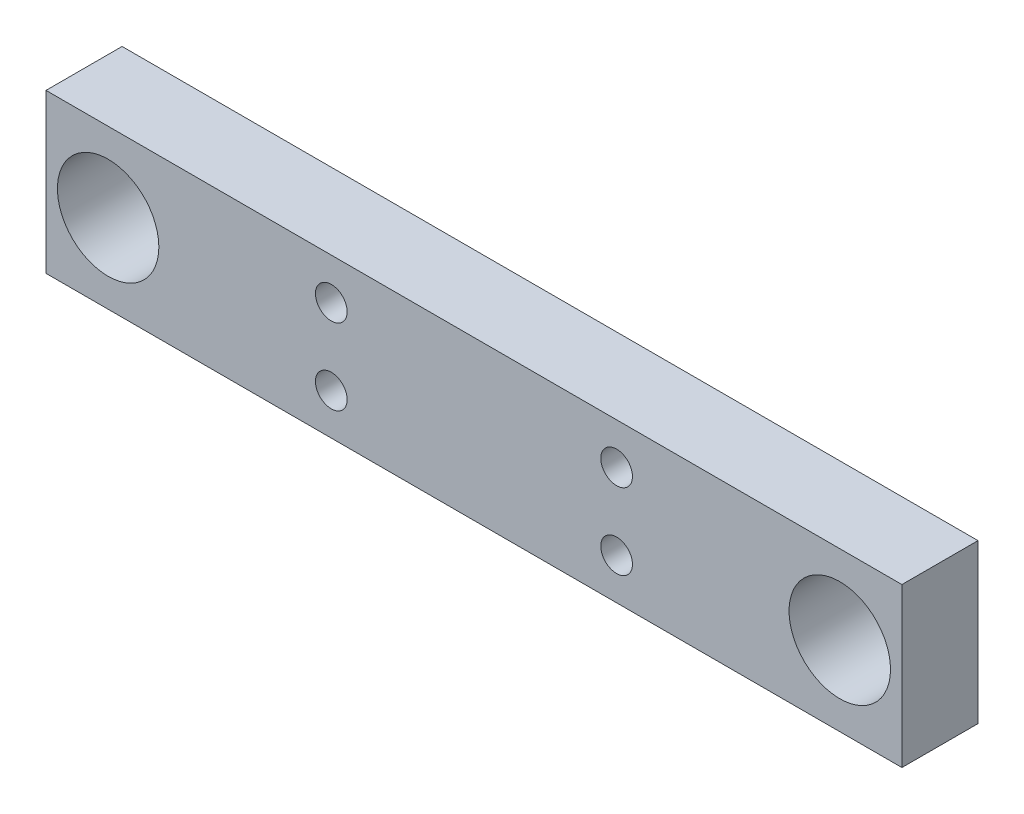
ISO-10303-21;
HEADER;
FILE_DESCRIPTION(('STEP AP214'),'2;1');
FILE_NAME('part.step','',(''),(''),'','','');
FILE_SCHEMA(('AUTOMOTIVE_DESIGN { 1 0 10303 214 1 1 1 1 }'));
ENDSEC;
DATA;
#1=APPLICATION_CONTEXT('core data for automotive mechanical design processes');
#2=APPLICATION_PROTOCOL_DEFINITION('international standard','automotive_design',2000,#1);
#3=PRODUCT_CONTEXT('',#1,'mechanical');
#4=PRODUCT('Part','Part','',(#3));
#5=PRODUCT_RELATED_PRODUCT_CATEGORY('part','',(#4));
#6=PRODUCT_DEFINITION_FORMATION('','',#4);
#7=PRODUCT_DEFINITION_CONTEXT('part definition',#1,'design');
#8=PRODUCT_DEFINITION('design','',#6,#7);
#9=PRODUCT_DEFINITION_SHAPE('','',#8);
#10=(LENGTH_UNIT() NAMED_UNIT(*) SI_UNIT(.MILLI.,.METRE.));
#11=(NAMED_UNIT(*) PLANE_ANGLE_UNIT() SI_UNIT($,.RADIAN.));
#12=(NAMED_UNIT(*) SI_UNIT($,.STERADIAN.) SOLID_ANGLE_UNIT());
#13=UNCERTAINTY_MEASURE_WITH_UNIT(LENGTH_MEASURE(1.E-05),#10,'distance_accuracy_value','');
#14=(GEOMETRIC_REPRESENTATION_CONTEXT(3) GLOBAL_UNCERTAINTY_ASSIGNED_CONTEXT((#13)) GLOBAL_UNIT_ASSIGNED_CONTEXT((#10,
#11,#12)) REPRESENTATION_CONTEXT('',''));
#15=CARTESIAN_POINT('',(0.,0.,0.));
#16=DIRECTION('',(0.,0.,1.));
#17=DIRECTION('',(1.,0.,0.));
#18=AXIS2_PLACEMENT_3D('',#15,#16,#17);
#19=CARTESIAN_POINT('',(-67.5,-12.5,6.));
#20=DIRECTION('',(0.,1.,0.));
#21=DIRECTION('',(-1.,0.,0.));
#22=AXIS2_PLACEMENT_3D('',#19,#20,#21);
#23=PLANE('',#22);
#24=DIRECTION('',(1.,0.,0.));
#25=VECTOR('',#24,1.);
#26=CARTESIAN_POINT('',(-67.5,-12.5,-6.));
#27=LINE('',#26,#25);
#28=CARTESIAN_POINT('',(-67.5,-12.5,-6.));
#29=VERTEX_POINT('',#28);
#30=CARTESIAN_POINT('',(67.5,-12.5,-6.));
#31=VERTEX_POINT('',#30);
#32=EDGE_CURVE('E107',#29,#31,#27,.T.);
#33=ORIENTED_EDGE('',*,*,#32,.T.);
#34=DIRECTION('',(0.,0.,-1.));
#35=VECTOR('',#34,1.);
#36=CARTESIAN_POINT('',(67.5,-12.5,6.));
#37=LINE('',#36,#35);
#38=CARTESIAN_POINT('',(67.5,-12.5,6.));
#39=VERTEX_POINT('',#38);
#40=EDGE_CURVE('E11',#39,#31,#37,.T.);
#41=ORIENTED_EDGE('',*,*,#40,.F.);
#42=DIRECTION('',(1.,0.,0.));
#43=VECTOR('',#42,1.);
#44=CARTESIAN_POINT('',(-67.5,-12.5,6.));
#45=LINE('',#44,#43);
#46=CARTESIAN_POINT('',(-67.5,-12.5,6.));
#47=VERTEX_POINT('',#46);
#48=EDGE_CURVE('E89',#47,#39,#45,.T.);
#49=ORIENTED_EDGE('',*,*,#48,.F.);
#50=DIRECTION('',(0.,0.,-1.));
#51=VECTOR('',#50,1.);
#52=CARTESIAN_POINT('',(-67.5,-12.5,6.));
#53=LINE('',#52,#51);
#54=EDGE_CURVE('E56',#47,#29,#53,.T.);
#55=ORIENTED_EDGE('',*,*,#54,.T.);
#56=EDGE_LOOP('',(#33,#41,#49,#55));
#57=FACE_BOUND('',#56,.T.);
#58=ADVANCED_FACE('F39',(#57),#23,.F.);
#59=CARTESIAN_POINT('',(67.5,-12.5,6.));
#60=DIRECTION('',(-1.,0.,0.));
#61=DIRECTION('',(0.,0.,1.));
#62=AXIS2_PLACEMENT_3D('',#59,#60,#61);
#63=PLANE('',#62);
#64=DIRECTION('',(0.,1.,0.));
#65=VECTOR('',#64,1.);
#66=CARTESIAN_POINT('',(67.5,-12.5,-6.));
#67=LINE('',#66,#65);
#68=CARTESIAN_POINT('',(67.5,12.5,-6.));
#69=VERTEX_POINT('',#68);
#70=EDGE_CURVE('E95',#31,#69,#67,.T.);
#71=ORIENTED_EDGE('',*,*,#70,.T.);
#72=DIRECTION('',(0.,0.,-1.));
#73=VECTOR('',#72,1.);
#74=CARTESIAN_POINT('',(67.5,12.5,6.));
#75=LINE('',#74,#73);
#76=CARTESIAN_POINT('',(67.5,12.5,6.));
#77=VERTEX_POINT('',#76);
#78=EDGE_CURVE('E48',#77,#69,#75,.T.);
#79=ORIENTED_EDGE('',*,*,#78,.F.);
#80=DIRECTION('',(0.,1.,0.));
#81=VECTOR('',#80,1.);
#82=CARTESIAN_POINT('',(67.5,-12.5,6.));
#83=LINE('',#82,#81);
#84=EDGE_CURVE('E81',#39,#77,#83,.T.);
#85=ORIENTED_EDGE('',*,*,#84,.F.);
#86=ORIENTED_EDGE('',*,*,#40,.T.);
#87=EDGE_LOOP('',(#71,#79,#85,#86));
#88=FACE_BOUND('',#87,.T.);
#89=ADVANCED_FACE('F94',(#88),#63,.F.);
#90=CARTESIAN_POINT('',(-67.5,12.5,6.));
#91=DIRECTION('',(0.,1.,0.));
#92=DIRECTION('',(0.,0.,1.));
#93=AXIS2_PLACEMENT_3D('',#90,#91,#92);
#94=PLANE('',#93);
#95=DIRECTION('',(1.,0.,0.));
#96=VECTOR('',#95,1.);
#97=CARTESIAN_POINT('',(-67.5,12.5,-6.));
#98=LINE('',#97,#96);
#99=CARTESIAN_POINT('',(-67.5,12.5,-6.));
#100=VERTEX_POINT('',#99);
#101=EDGE_CURVE('E113',#100,#69,#98,.T.);
#102=ORIENTED_EDGE('',*,*,#101,.F.);
#103=DIRECTION('',(0.,0.,-1.));
#104=VECTOR('',#103,1.);
#105=CARTESIAN_POINT('',(-67.5,12.5,6.));
#106=LINE('',#105,#104);
#107=CARTESIAN_POINT('',(-67.5,12.5,6.));
#108=VERTEX_POINT('',#107);
#109=EDGE_CURVE('E70',#108,#100,#106,.T.);
#110=ORIENTED_EDGE('',*,*,#109,.F.);
#111=DIRECTION('',(1.,0.,0.));
#112=VECTOR('',#111,1.);
#113=CARTESIAN_POINT('',(-67.5,12.5,6.));
#114=LINE('',#113,#112);
#115=EDGE_CURVE('E88',#108,#77,#114,.T.);
#116=ORIENTED_EDGE('',*,*,#115,.T.);
#117=ORIENTED_EDGE('',*,*,#78,.T.);
#118=EDGE_LOOP('',(#102,#110,#116,#117));
#119=FACE_BOUND('',#118,.T.);
#120=ADVANCED_FACE('F99',(#119),#94,.T.);
#121=CARTESIAN_POINT('',(-67.5,-12.5,6.));
#122=DIRECTION('',(-1.,0.,0.));
#123=DIRECTION('',(0.,0.,1.));
#124=AXIS2_PLACEMENT_3D('',#121,#122,#123);
#125=PLANE('',#124);
#126=DIRECTION('',(0.,1.,0.));
#127=VECTOR('',#126,1.);
#128=CARTESIAN_POINT('',(-67.5,-12.5,-6.));
#129=LINE('',#128,#127);
#130=EDGE_CURVE('E116',#29,#100,#129,.T.);
#131=ORIENTED_EDGE('',*,*,#130,.F.);
#132=ORIENTED_EDGE('',*,*,#54,.F.);
#133=DIRECTION('',(0.,1.,0.));
#134=VECTOR('',#133,1.);
#135=CARTESIAN_POINT('',(-67.5,-12.5,6.));
#136=LINE('',#135,#134);
#137=EDGE_CURVE('E101',#47,#108,#136,.T.);
#138=ORIENTED_EDGE('',*,*,#137,.T.);
#139=ORIENTED_EDGE('',*,*,#109,.T.);
#140=EDGE_LOOP('',(#131,#132,#138,#139));
#141=FACE_BOUND('',#140,.T.);
#142=ADVANCED_FACE('F186',(#141),#125,.T.);
#143=CARTESIAN_POINT('',(0.,0.,6.));
#144=DIRECTION('',(0.,0.,1.));
#145=DIRECTION('',(1.,0.,0.));
#146=AXIS2_PLACEMENT_3D('',#143,#144,#145);
#147=PLANE('',#146);
#148=CARTESIAN_POINT('',(57.7,0.,6.));
#149=DIRECTION('',(0.,0.,1.));
#150=DIRECTION('',(1.,0.,0.));
#151=AXIS2_PLACEMENT_3D('',#148,#149,#150);
#152=CIRCLE('',#151,8.);
#153=CARTESIAN_POINT('',(65.7,0.,6.));
#154=VERTEX_POINT('',#153);
#155=EDGE_CURVE('E166',#154,#154,#152,.T.);
#156=ORIENTED_EDGE('',*,*,#155,.F.);
#157=EDGE_LOOP('',(#156));
#158=FACE_BOUND('',#157,.T.);
#159=CARTESIAN_POINT('',(-57.7,0.,6.));
#160=DIRECTION('',(0.,0.,1.));
#161=DIRECTION('',(1.,0.,0.));
#162=AXIS2_PLACEMENT_3D('',#159,#160,#161);
#163=CIRCLE('',#162,8.);
#164=CARTESIAN_POINT('',(-49.7,0.,6.));
#165=VERTEX_POINT('',#164);
#166=EDGE_CURVE('E158',#165,#165,#163,.T.);
#167=ORIENTED_EDGE('',*,*,#166,.F.);
#168=EDGE_LOOP('',(#167));
#169=FACE_BOUND('',#168,.T.);
#170=CARTESIAN_POINT('',(-22.5,6.,6.));
#171=DIRECTION('',(0.,0.,1.));
#172=DIRECTION('',(1.,0.,0.));
#173=AXIS2_PLACEMENT_3D('',#170,#171,#172);
#174=CIRCLE('',#173,2.5);
#175=CARTESIAN_POINT('',(-20.,6.,6.));
#176=VERTEX_POINT('',#175);
#177=EDGE_CURVE('E153',#176,#176,#174,.T.);
#178=ORIENTED_EDGE('',*,*,#177,.F.);
#179=EDGE_LOOP('',(#178));
#180=FACE_BOUND('',#179,.T.);
#181=CARTESIAN_POINT('',(-22.5,-6.,6.));
#182=DIRECTION('',(0.,0.,1.));
#183=DIRECTION('',(1.,0.,0.));
#184=AXIS2_PLACEMENT_3D('',#181,#182,#183);
#185=CIRCLE('',#184,2.5);
#186=CARTESIAN_POINT('',(-20.,-6.,6.));
#187=VERTEX_POINT('',#186);
#188=EDGE_CURVE('E145',#187,#187,#185,.T.);
#189=ORIENTED_EDGE('',*,*,#188,.F.);
#190=EDGE_LOOP('',(#189));
#191=FACE_BOUND('',#190,.T.);
#192=CARTESIAN_POINT('',(22.5,6.,6.));
#193=DIRECTION('',(0.,0.,1.));
#194=DIRECTION('',(1.,0.,0.));
#195=AXIS2_PLACEMENT_3D('',#192,#193,#194);
#196=CIRCLE('',#195,2.5);
#197=CARTESIAN_POINT('',(25.,6.,6.));
#198=VERTEX_POINT('',#197);
#199=EDGE_CURVE('E137',#198,#198,#196,.T.);
#200=ORIENTED_EDGE('',*,*,#199,.F.);
#201=EDGE_LOOP('',(#200));
#202=FACE_BOUND('',#201,.T.);
#203=CARTESIAN_POINT('',(22.5,-6.,6.));
#204=DIRECTION('',(0.,0.,1.));
#205=DIRECTION('',(1.,0.,0.));
#206=AXIS2_PLACEMENT_3D('',#203,#204,#205);
#207=CIRCLE('',#206,2.5);
#208=CARTESIAN_POINT('',(25.,-6.,6.));
#209=VERTEX_POINT('',#208);
#210=EDGE_CURVE('E129',#209,#209,#207,.T.);
#211=ORIENTED_EDGE('',*,*,#210,.F.);
#212=EDGE_LOOP('',(#211));
#213=FACE_BOUND('',#212,.T.);
#214=ORIENTED_EDGE('',*,*,#48,.T.);
#215=ORIENTED_EDGE('',*,*,#84,.T.);
#216=ORIENTED_EDGE('',*,*,#115,.F.);
#217=ORIENTED_EDGE('',*,*,#137,.F.);
#218=EDGE_LOOP('',(#214,#215,#216,#217));
#219=FACE_BOUND('',#218,.T.);
#220=ADVANCED_FACE('F85',(#158,#169,#180,#191,#202,#213,#219),#147,.T.);
#221=CARTESIAN_POINT('',(0.,0.,-6.));
#222=DIRECTION('',(0.,0.,1.));
#223=DIRECTION('',(1.,0.,0.));
#224=AXIS2_PLACEMENT_3D('',#221,#222,#223);
#225=PLANE('',#224);
#226=CARTESIAN_POINT('',(57.7,0.,-6.));
#227=DIRECTION('',(0.,0.,1.));
#228=DIRECTION('',(1.,0.,0.));
#229=AXIS2_PLACEMENT_3D('',#226,#227,#228);
#230=CIRCLE('',#229,8.);
#231=CARTESIAN_POINT('',(65.7,0.,-6.));
#232=VERTEX_POINT('',#231);
#233=EDGE_CURVE('E157',#232,#232,#230,.T.);
#234=ORIENTED_EDGE('',*,*,#233,.T.);
#235=EDGE_LOOP('',(#234));
#236=FACE_BOUND('',#235,.T.);
#237=CARTESIAN_POINT('',(-57.7,0.,-6.));
#238=DIRECTION('',(0.,0.,1.));
#239=DIRECTION('',(1.,0.,0.));
#240=AXIS2_PLACEMENT_3D('',#237,#238,#239);
#241=CIRCLE('',#240,8.);
#242=CARTESIAN_POINT('',(-49.7,0.,-6.));
#243=VERTEX_POINT('',#242);
#244=EDGE_CURVE('E162',#243,#243,#241,.T.);
#245=ORIENTED_EDGE('',*,*,#244,.T.);
#246=EDGE_LOOP('',(#245));
#247=FACE_BOUND('',#246,.T.);
#248=CARTESIAN_POINT('',(-22.5,6.,-6.));
#249=DIRECTION('',(0.,0.,1.));
#250=DIRECTION('',(1.,0.,0.));
#251=AXIS2_PLACEMENT_3D('',#248,#249,#250);
#252=CIRCLE('',#251,2.5);
#253=CARTESIAN_POINT('',(-20.,6.,-6.));
#254=VERTEX_POINT('',#253);
#255=EDGE_CURVE('E149',#254,#254,#252,.T.);
#256=ORIENTED_EDGE('',*,*,#255,.T.);
#257=EDGE_LOOP('',(#256));
#258=FACE_BOUND('',#257,.T.);
#259=CARTESIAN_POINT('',(-22.5,-6.,-6.));
#260=DIRECTION('',(0.,0.,1.));
#261=DIRECTION('',(1.,0.,0.));
#262=AXIS2_PLACEMENT_3D('',#259,#260,#261);
#263=CIRCLE('',#262,2.5);
#264=CARTESIAN_POINT('',(-20.,-6.,-6.));
#265=VERTEX_POINT('',#264);
#266=EDGE_CURVE('E141',#265,#265,#263,.T.);
#267=ORIENTED_EDGE('',*,*,#266,.T.);
#268=EDGE_LOOP('',(#267));
#269=FACE_BOUND('',#268,.T.);
#270=CARTESIAN_POINT('',(22.5,6.,-6.));
#271=DIRECTION('',(0.,0.,1.));
#272=DIRECTION('',(1.,0.,0.));
#273=AXIS2_PLACEMENT_3D('',#270,#271,#272);
#274=CIRCLE('',#273,2.5);
#275=CARTESIAN_POINT('',(25.,6.,-6.));
#276=VERTEX_POINT('',#275);
#277=EDGE_CURVE('E133',#276,#276,#274,.T.);
#278=ORIENTED_EDGE('',*,*,#277,.T.);
#279=EDGE_LOOP('',(#278));
#280=FACE_BOUND('',#279,.T.);
#281=CARTESIAN_POINT('',(22.5,-6.,-6.));
#282=DIRECTION('',(0.,0.,1.));
#283=DIRECTION('',(1.,0.,0.));
#284=AXIS2_PLACEMENT_3D('',#281,#282,#283);
#285=CIRCLE('',#284,2.5);
#286=CARTESIAN_POINT('',(25.,-6.,-6.));
#287=VERTEX_POINT('',#286);
#288=EDGE_CURVE('E110',#287,#287,#285,.T.);
#289=ORIENTED_EDGE('',*,*,#288,.T.);
#290=EDGE_LOOP('',(#289));
#291=FACE_BOUND('',#290,.T.);
#292=ORIENTED_EDGE('',*,*,#32,.F.);
#293=ORIENTED_EDGE('',*,*,#130,.T.);
#294=ORIENTED_EDGE('',*,*,#101,.T.);
#295=ORIENTED_EDGE('',*,*,#70,.F.);
#296=EDGE_LOOP('',(#292,#293,#294,#295));
#297=FACE_BOUND('',#296,.T.);
#298=ADVANCED_FACE('F174',(#236,#247,#258,#269,#280,#291,#297),#225,.F.);
#299=CARTESIAN_POINT('',(22.5,-6.,6.));
#300=DIRECTION('',(0.,0.,1.));
#301=DIRECTION('',(1.,0.,0.));
#302=AXIS2_PLACEMENT_3D('',#299,#300,#301);
#303=CYLINDRICAL_SURFACE('',#302,2.5);
#304=ORIENTED_EDGE('',*,*,#288,.F.);
#305=EDGE_LOOP('',(#304));
#306=FACE_BOUND('',#305,.T.);
#307=ORIENTED_EDGE('',*,*,#210,.T.);
#308=EDGE_LOOP('',(#307));
#309=FACE_BOUND('',#308,.T.);
#310=ADVANCED_FACE('F198',(#306,#309),#303,.F.);
#311=CARTESIAN_POINT('',(22.5,6.,6.));
#312=DIRECTION('',(0.,0.,1.));
#313=DIRECTION('',(1.,0.,0.));
#314=AXIS2_PLACEMENT_3D('',#311,#312,#313);
#315=CYLINDRICAL_SURFACE('',#314,2.5);
#316=ORIENTED_EDGE('',*,*,#277,.F.);
#317=EDGE_LOOP('',(#316));
#318=FACE_BOUND('',#317,.T.);
#319=ORIENTED_EDGE('',*,*,#199,.T.);
#320=EDGE_LOOP('',(#319));
#321=FACE_BOUND('',#320,.T.);
#322=ADVANCED_FACE('F200',(#318,#321),#315,.F.);
#323=CARTESIAN_POINT('',(-22.5,-6.,6.));
#324=DIRECTION('',(0.,0.,1.));
#325=DIRECTION('',(1.,0.,0.));
#326=AXIS2_PLACEMENT_3D('',#323,#324,#325);
#327=CYLINDRICAL_SURFACE('',#326,2.5);
#328=ORIENTED_EDGE('',*,*,#266,.F.);
#329=EDGE_LOOP('',(#328));
#330=FACE_BOUND('',#329,.T.);
#331=ORIENTED_EDGE('',*,*,#188,.T.);
#332=EDGE_LOOP('',(#331));
#333=FACE_BOUND('',#332,.T.);
#334=ADVANCED_FACE('F207',(#330,#333),#327,.F.);
#335=CARTESIAN_POINT('',(-22.5,6.,6.));
#336=DIRECTION('',(0.,0.,1.));
#337=DIRECTION('',(1.,0.,0.));
#338=AXIS2_PLACEMENT_3D('',#335,#336,#337);
#339=CYLINDRICAL_SURFACE('',#338,2.5);
#340=ORIENTED_EDGE('',*,*,#255,.F.);
#341=EDGE_LOOP('',(#340));
#342=FACE_BOUND('',#341,.T.);
#343=ORIENTED_EDGE('',*,*,#177,.T.);
#344=EDGE_LOOP('',(#343));
#345=FACE_BOUND('',#344,.T.);
#346=ADVANCED_FACE('F269',(#342,#345),#339,.F.);
#347=CARTESIAN_POINT('',(-57.7,0.,-6.));
#348=DIRECTION('',(0.,0.,1.));
#349=DIRECTION('',(1.,0.,0.));
#350=AXIS2_PLACEMENT_3D('',#347,#348,#349);
#351=CYLINDRICAL_SURFACE('',#350,8.);
#352=ORIENTED_EDGE('',*,*,#244,.F.);
#353=EDGE_LOOP('',(#352));
#354=FACE_BOUND('',#353,.T.);
#355=ORIENTED_EDGE('',*,*,#166,.T.);
#356=EDGE_LOOP('',(#355));
#357=FACE_BOUND('',#356,.T.);
#358=ADVANCED_FACE('F180',(#354,#357),#351,.F.);
#359=CARTESIAN_POINT('',(57.7,0.,-6.));
#360=DIRECTION('',(0.,0.,1.));
#361=DIRECTION('',(1.,0.,0.));
#362=AXIS2_PLACEMENT_3D('',#359,#360,#361);
#363=CYLINDRICAL_SURFACE('',#362,8.);
#364=ORIENTED_EDGE('',*,*,#233,.F.);
#365=EDGE_LOOP('',(#364));
#366=FACE_BOUND('',#365,.T.);
#367=ORIENTED_EDGE('',*,*,#155,.T.);
#368=EDGE_LOOP('',(#367));
#369=FACE_BOUND('',#368,.T.);
#370=ADVANCED_FACE('F177',(#366,#369),#363,.F.);
#371=CLOSED_SHELL('',(#58,#89,#120,#142,#220,#298,#310,#322,#334,#346,#358,#370));
#372=MANIFOLD_SOLID_BREP('B2',#371);
#373=ADVANCED_BREP_SHAPE_REPRESENTATION('',(#18,#372),#14);
#374=SHAPE_DEFINITION_REPRESENTATION(#9,#373);
ENDSEC;
END-ISO-10303-21;
